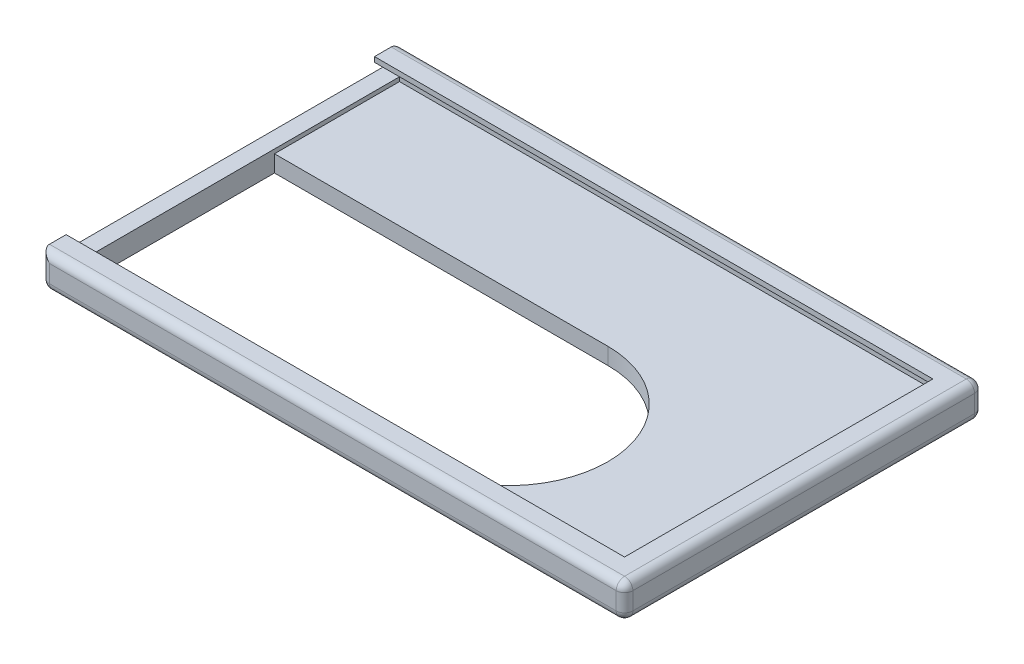
ISO-10303-21;
HEADER;
FILE_DESCRIPTION(('STEP AP214'),'2;1');
FILE_NAME('part.step','',(''),(''),'','','');
FILE_SCHEMA(('AUTOMOTIVE_DESIGN { 1 0 10303 214 1 1 1 1 }'));
ENDSEC;
DATA;
#1=APPLICATION_CONTEXT('core data for automotive mechanical design processes');
#2=APPLICATION_PROTOCOL_DEFINITION('international standard','automotive_design',2000,#1);
#3=PRODUCT_CONTEXT('',#1,'mechanical');
#4=PRODUCT('Part','Part','',(#3));
#5=PRODUCT_RELATED_PRODUCT_CATEGORY('part','',(#4));
#6=PRODUCT_DEFINITION_FORMATION('','',#4);
#7=PRODUCT_DEFINITION_CONTEXT('part definition',#1,'design');
#8=PRODUCT_DEFINITION('design','',#6,#7);
#9=PRODUCT_DEFINITION_SHAPE('','',#8);
#10=(LENGTH_UNIT() NAMED_UNIT(*) SI_UNIT(.MILLI.,.METRE.));
#11=(NAMED_UNIT(*) PLANE_ANGLE_UNIT() SI_UNIT($,.RADIAN.));
#12=(NAMED_UNIT(*) SI_UNIT($,.STERADIAN.) SOLID_ANGLE_UNIT());
#13=UNCERTAINTY_MEASURE_WITH_UNIT(LENGTH_MEASURE(1.E-05),#10,'distance_accuracy_value','');
#14=(GEOMETRIC_REPRESENTATION_CONTEXT(3) GLOBAL_UNCERTAINTY_ASSIGNED_CONTEXT((#13)) GLOBAL_UNIT_ASSIGNED_CONTEXT((#10,
#11,#12)) REPRESENTATION_CONTEXT('',''));
#15=CARTESIAN_POINT('',(0.,0.,0.));
#16=DIRECTION('',(0.,0.,1.));
#17=DIRECTION('',(1.,0.,0.));
#18=AXIS2_PLACEMENT_3D('',#15,#16,#17);
#19=CARTESIAN_POINT('',(0.,2.,0.));
#20=DIRECTION('',(0.,-1.,0.));
#21=DIRECTION('',(0.,0.,-1.));
#22=AXIS2_PLACEMENT_3D('',#19,#20,#21);
#23=PLANE('',#22);
#24=CARTESIAN_POINT('',(40.,2.,27.));
#25=DIRECTION('',(0.,-1.,0.));
#26=DIRECTION('',(0.,0.,-1.));
#27=AXIS2_PLACEMENT_3D('',#24,#25,#26);
#28=CIRCLE('',#27,12.);
#29=CARTESIAN_POINT('',(40.,2.,39.));
#30=VERTEX_POINT('',#29);
#31=CARTESIAN_POINT('',(40.,2.,15.));
#32=VERTEX_POINT('',#31);
#33=EDGE_CURVE('E273',#30,#32,#28,.F.);
#34=ORIENTED_EDGE('',*,*,#33,.F.);
#35=DIRECTION('',(-1.,0.,0.));
#36=VECTOR('',#35,1.);
#37=CARTESIAN_POINT('',(66.,2.,39.));
#38=LINE('',#37,#36);
#39=CARTESIAN_POINT('',(66.,2.,39.));
#40=VERTEX_POINT('',#39);
#41=EDGE_CURVE('E307',#40,#30,#38,.T.);
#42=ORIENTED_EDGE('',*,*,#41,.F.);
#43=DIRECTION('',(0.,0.,1.));
#44=VECTOR('',#43,1.);
#45=CARTESIAN_POINT('',(66.,2.,0.));
#46=LINE('',#45,#44);
#47=CARTESIAN_POINT('',(66.,2.,0.));
#48=VERTEX_POINT('',#47);
#49=EDGE_CURVE('E304',#48,#40,#46,.T.);
#50=ORIENTED_EDGE('',*,*,#49,.F.);
#51=DIRECTION('',(1.,0.,0.));
#52=VECTOR('',#51,1.);
#53=CARTESIAN_POINT('',(0.,2.,0.));
#54=LINE('',#53,#52);
#55=CARTESIAN_POINT('',(0.,2.,0.));
#56=VERTEX_POINT('',#55);
#57=EDGE_CURVE('E301',#56,#48,#54,.T.);
#58=ORIENTED_EDGE('',*,*,#57,.F.);
#59=DIRECTION('',(0.,0.,1.));
#60=VECTOR('',#59,1.);
#61=CARTESIAN_POINT('',(0.,2.,0.));
#62=LINE('',#61,#60);
#63=CARTESIAN_POINT('',(0.,2.,15.));
#64=VERTEX_POINT('',#63);
#65=EDGE_CURVE('E310',#56,#64,#62,.T.);
#66=ORIENTED_EDGE('',*,*,#65,.T.);
#67=DIRECTION('',(-1.,0.,0.));
#68=VECTOR('',#67,1.);
#69=CARTESIAN_POINT('',(0.,2.,15.));
#70=LINE('',#69,#68);
#71=EDGE_CURVE('E271',#32,#64,#70,.T.);
#72=ORIENTED_EDGE('',*,*,#71,.F.);
#73=EDGE_LOOP('',(#34,#42,#50,#58,#66,#72));
#74=FACE_BOUND('',#73,.T.);
#75=ADVANCED_FACE('F39',(#74),#23,.F.);
#76=CARTESIAN_POINT('',(0.,0.,0.));
#77=DIRECTION('',(0.,-1.,0.));
#78=DIRECTION('',(0.,0.,-1.));
#79=AXIS2_PLACEMENT_3D('',#76,#77,#78);
#80=PLANE('',#79);
#81=DIRECTION('',(0.,0.,1.));
#82=VECTOR('',#81,1.);
#83=CARTESIAN_POINT('',(67.,0.,0.));
#84=LINE('',#83,#82);
#85=CARTESIAN_POINT('',(67.,0.,-1.));
#86=VERTEX_POINT('',#85);
#87=CARTESIAN_POINT('',(67.,0.,40.));
#88=VERTEX_POINT('',#87);
#89=EDGE_CURVE('E338',#86,#88,#84,.T.);
#90=ORIENTED_EDGE('',*,*,#89,.T.);
#91=DIRECTION('',(1.,0.,0.));
#92=VECTOR('',#91,1.);
#93=CARTESIAN_POINT('',(-2.,0.,40.));
#94=LINE('',#93,#92);
#95=CARTESIAN_POINT('',(-0.999999999999995,0.,40.));
#96=VERTEX_POINT('',#95);
#97=EDGE_CURVE('E340',#88,#96,#94,.F.);
#98=ORIENTED_EDGE('',*,*,#97,.T.);
#99=DIRECTION('',(0.,0.,1.));
#100=VECTOR('',#99,1.);
#101=CARTESIAN_POINT('',(-1.,0.,-2.));
#102=LINE('',#101,#100);
#103=CARTESIAN_POINT('',(-1.,0.,-1.));
#104=VERTEX_POINT('',#103);
#105=EDGE_CURVE('E334',#96,#104,#102,.F.);
#106=ORIENTED_EDGE('',*,*,#105,.T.);
#107=DIRECTION('',(1.,0.,0.));
#108=VECTOR('',#107,1.);
#109=CARTESIAN_POINT('',(0.,0.,-1.));
#110=LINE('',#109,#108);
#111=EDGE_CURVE('E336',#104,#86,#110,.T.);
#112=ORIENTED_EDGE('',*,*,#111,.T.);
#113=EDGE_LOOP('',(#90,#98,#106,#112));
#114=FACE_BOUND('',#113,.T.);
#115=DIRECTION('',(0.,0.,1.));
#116=VECTOR('',#115,1.);
#117=CARTESIAN_POINT('',(0.,0.,0.));
#118=LINE('',#117,#116);
#119=CARTESIAN_POINT('',(0.,0.,15.));
#120=VERTEX_POINT('',#119);
#121=CARTESIAN_POINT('',(0.,0.,39.));
#122=VERTEX_POINT('',#121);
#123=EDGE_CURVE('E282',#120,#122,#118,.T.);
#124=ORIENTED_EDGE('',*,*,#123,.T.);
#125=DIRECTION('',(1.,0.,0.));
#126=VECTOR('',#125,1.);
#127=CARTESIAN_POINT('',(0.,0.,39.));
#128=LINE('',#127,#126);
#129=CARTESIAN_POINT('',(40.,0.,39.));
#130=VERTEX_POINT('',#129);
#131=EDGE_CURVE('E285',#122,#130,#128,.T.);
#132=ORIENTED_EDGE('',*,*,#131,.T.);
#133=CARTESIAN_POINT('',(40.,0.,27.));
#134=DIRECTION('',(0.,1.,0.));
#135=DIRECTION('',(0.,0.,1.));
#136=AXIS2_PLACEMENT_3D('',#133,#134,#135);
#137=CIRCLE('',#136,12.);
#138=CARTESIAN_POINT('',(40.,0.,15.));
#139=VERTEX_POINT('',#138);
#140=EDGE_CURVE('E269',#139,#130,#137,.F.);
#141=ORIENTED_EDGE('',*,*,#140,.F.);
#142=DIRECTION('',(1.,0.,0.));
#143=VECTOR('',#142,1.);
#144=CARTESIAN_POINT('',(0.,0.,15.));
#145=LINE('',#144,#143);
#146=EDGE_CURVE('E280',#120,#139,#145,.T.);
#147=ORIENTED_EDGE('',*,*,#146,.F.);
#148=EDGE_LOOP('',(#124,#132,#141,#147));
#149=FACE_BOUND('',#148,.T.);
#150=ADVANCED_FACE('F465',(#114,#149),#80,.T.);
#151=CARTESIAN_POINT('',(66.,4.,0.));
#152=DIRECTION('',(1.,0.,0.));
#153=DIRECTION('',(0.,0.,-1.));
#154=AXIS2_PLACEMENT_3D('',#151,#152,#153);
#155=PLANE('',#154);
#156=DIRECTION('',(0.,-1.,0.));
#157=VECTOR('',#156,1.);
#158=CARTESIAN_POINT('',(66.,4.,39.));
#159=LINE('',#158,#157);
#160=CARTESIAN_POINT('',(66.,3.5,39.));
#161=VERTEX_POINT('',#160);
#162=EDGE_CURVE('E299',#161,#40,#159,.T.);
#163=ORIENTED_EDGE('',*,*,#162,.F.);
#164=DIRECTION('',(0.,0.,-1.));
#165=VECTOR('',#164,1.);
#166=CARTESIAN_POINT('',(66.,3.5,0.));
#167=LINE('',#166,#165);
#168=CARTESIAN_POINT('',(66.,3.5,0.));
#169=VERTEX_POINT('',#168);
#170=EDGE_CURVE('E252',#161,#169,#167,.T.);
#171=ORIENTED_EDGE('',*,*,#170,.T.);
#172=DIRECTION('',(0.,-1.,0.));
#173=VECTOR('',#172,1.);
#174=CARTESIAN_POINT('',(66.,4.,0.));
#175=LINE('',#174,#173);
#176=EDGE_CURVE('E277',#169,#48,#175,.T.);
#177=ORIENTED_EDGE('',*,*,#176,.T.);
#178=ORIENTED_EDGE('',*,*,#49,.T.);
#179=EDGE_LOOP('',(#163,#171,#177,#178));
#180=FACE_BOUND('',#179,.T.);
#181=ADVANCED_FACE('F500',(#180),#155,.F.);
#182=CARTESIAN_POINT('',(0.,4.,39.));
#183=DIRECTION('',(0.,0.,1.));
#184=DIRECTION('',(1.,0.,0.));
#185=AXIS2_PLACEMENT_3D('',#182,#183,#184);
#186=PLANE('',#185);
#187=DIRECTION('',(0.,1.,0.));
#188=VECTOR('',#187,1.);
#189=CARTESIAN_POINT('',(-2.,3.99999999999999,39.));
#190=LINE('',#189,#188);
#191=CARTESIAN_POINT('',(-2.,2.5,39.));
#192=VERTEX_POINT('',#191);
#193=CARTESIAN_POINT('',(-2.,3.5,39.));
#194=VERTEX_POINT('',#193);
#195=EDGE_CURVE('E256',#192,#194,#190,.T.);
#196=ORIENTED_EDGE('',*,*,#195,.T.);
#197=DIRECTION('',(1.,0.,0.));
#198=VECTOR('',#197,1.);
#199=CARTESIAN_POINT('',(0.,3.5,39.));
#200=LINE('',#199,#198);
#201=EDGE_CURVE('E254',#194,#161,#200,.T.);
#202=ORIENTED_EDGE('',*,*,#201,.T.);
#203=ORIENTED_EDGE('',*,*,#162,.T.);
#204=ORIENTED_EDGE('',*,*,#41,.T.);
#205=DIRECTION('',(0.,-1.,0.));
#206=VECTOR('',#205,1.);
#207=CARTESIAN_POINT('',(40.,59.2712842531054,39.));
#208=LINE('',#207,#206);
#209=EDGE_CURVE('E288',#30,#130,#208,.T.);
#210=ORIENTED_EDGE('',*,*,#209,.T.);
#211=ORIENTED_EDGE('',*,*,#131,.F.);
#212=DIRECTION('',(0.,-1.,0.));
#213=VECTOR('',#212,1.);
#214=CARTESIAN_POINT('',(0.,4.,39.));
#215=LINE('',#214,#213);
#216=CARTESIAN_POINT('',(0.,2.5,39.));
#217=VERTEX_POINT('',#216);
#218=EDGE_CURVE('E297',#217,#122,#215,.T.);
#219=ORIENTED_EDGE('',*,*,#218,.F.);
#220=DIRECTION('',(1.,0.,0.));
#221=VECTOR('',#220,1.);
#222=CARTESIAN_POINT('',(-2.001,2.5,39.));
#223=LINE('',#222,#221);
#224=EDGE_CURVE('E266',#192,#217,#223,.T.);
#225=ORIENTED_EDGE('',*,*,#224,.F.);
#226=EDGE_LOOP('',(#196,#202,#203,#204,#210,#211,#219,#225));
#227=FACE_BOUND('',#226,.T.);
#228=ADVANCED_FACE('F577',(#227),#186,.F.);
#229=CARTESIAN_POINT('',(0.,4.,0.));
#230=DIRECTION('',(1.,0.,0.));
#231=DIRECTION('',(0.,0.,-1.));
#232=AXIS2_PLACEMENT_3D('',#229,#230,#231);
#233=PLANE('',#232);
#234=DIRECTION('',(0.,0.,-1.));
#235=VECTOR('',#234,1.);
#236=CARTESIAN_POINT('',(0.,2.5,0.));
#237=LINE('',#236,#235);
#238=CARTESIAN_POINT('',(0.,2.5,0.));
#239=VERTEX_POINT('',#238);
#240=EDGE_CURVE('E263',#217,#239,#237,.T.);
#241=ORIENTED_EDGE('',*,*,#240,.F.);
#242=ORIENTED_EDGE('',*,*,#218,.T.);
#243=ORIENTED_EDGE('',*,*,#123,.F.);
#244=DIRECTION('',(0.,-1.,0.));
#245=VECTOR('',#244,1.);
#246=CARTESIAN_POINT('',(0.,59.2712842531054,15.));
#247=LINE('',#246,#245);
#248=EDGE_CURVE('E290',#64,#120,#247,.T.);
#249=ORIENTED_EDGE('',*,*,#248,.F.);
#250=ORIENTED_EDGE('',*,*,#65,.F.);
#251=DIRECTION('',(0.,-1.,0.));
#252=VECTOR('',#251,1.);
#253=CARTESIAN_POINT('',(0.,4.,0.));
#254=LINE('',#253,#252);
#255=EDGE_CURVE('E295',#239,#56,#254,.T.);
#256=ORIENTED_EDGE('',*,*,#255,.F.);
#257=EDGE_LOOP('',(#241,#242,#243,#249,#250,#256));
#258=FACE_BOUND('',#257,.T.);
#259=ADVANCED_FACE('F573',(#258),#233,.T.);
#260=CARTESIAN_POINT('',(0.,4.,0.));
#261=DIRECTION('',(0.,0.,-1.));
#262=DIRECTION('',(-1.,0.,0.));
#263=AXIS2_PLACEMENT_3D('',#260,#261,#262);
#264=PLANE('',#263);
#265=ORIENTED_EDGE('',*,*,#176,.F.);
#266=DIRECTION('',(-1.,0.,0.));
#267=VECTOR('',#266,1.);
#268=CARTESIAN_POINT('',(0.,3.5,0.));
#269=LINE('',#268,#267);
#270=CARTESIAN_POINT('',(-2.,3.5,0.));
#271=VERTEX_POINT('',#270);
#272=EDGE_CURVE('E247',#169,#271,#269,.T.);
#273=ORIENTED_EDGE('',*,*,#272,.T.);
#274=DIRECTION('',(0.,-1.,0.));
#275=VECTOR('',#274,1.);
#276=CARTESIAN_POINT('',(-2.,4.,0.));
#277=LINE('',#276,#275);
#278=CARTESIAN_POINT('',(-2.,2.5,0.));
#279=VERTEX_POINT('',#278);
#280=EDGE_CURVE('E261',#271,#279,#277,.T.);
#281=ORIENTED_EDGE('',*,*,#280,.T.);
#282=DIRECTION('',(1.,0.,0.));
#283=VECTOR('',#282,1.);
#284=CARTESIAN_POINT('',(-2.00100000000001,2.5,0.));
#285=LINE('',#284,#283);
#286=EDGE_CURVE('E267',#279,#239,#285,.T.);
#287=ORIENTED_EDGE('',*,*,#286,.T.);
#288=ORIENTED_EDGE('',*,*,#255,.T.);
#289=ORIENTED_EDGE('',*,*,#57,.T.);
#290=EDGE_LOOP('',(#265,#273,#281,#287,#288,#289));
#291=FACE_BOUND('',#290,.T.);
#292=ADVANCED_FACE('F570',(#291),#264,.F.);
#293=CARTESIAN_POINT('',(0.,4.,-2.));
#294=DIRECTION('',(0.,0.,-1.));
#295=DIRECTION('',(-1.,0.,0.));
#296=AXIS2_PLACEMENT_3D('',#293,#294,#295);
#297=PLANE('',#296);
#298=DIRECTION('',(-1.,0.,0.));
#299=VECTOR('',#298,1.);
#300=CARTESIAN_POINT('',(68.,3.1,-2.));
#301=LINE('',#300,#299);
#302=CARTESIAN_POINT('',(-1.,3.1,-2.));
#303=VERTEX_POINT('',#302);
#304=CARTESIAN_POINT('',(67.,3.1,-2.));
#305=VERTEX_POINT('',#304);
#306=EDGE_CURVE('E48',#303,#305,#301,.F.);
#307=ORIENTED_EDGE('',*,*,#306,.T.);
#308=DIRECTION('',(0.,-1.,0.));
#309=VECTOR('',#308,1.);
#310=CARTESIAN_POINT('',(67.,4.,-2.));
#311=LINE('',#310,#309);
#312=CARTESIAN_POINT('',(67.,1.,-2.));
#313=VERTEX_POINT('',#312);
#314=EDGE_CURVE('E11',#305,#313,#311,.T.);
#315=ORIENTED_EDGE('',*,*,#314,.T.);
#316=DIRECTION('',(1.,0.,0.));
#317=VECTOR('',#316,1.);
#318=CARTESIAN_POINT('',(0.,1.,-2.));
#319=LINE('',#318,#317);
#320=CARTESIAN_POINT('',(-1.,1.,-2.));
#321=VERTEX_POINT('',#320);
#322=EDGE_CURVE('E352',#313,#321,#319,.F.);
#323=ORIENTED_EDGE('',*,*,#322,.T.);
#324=DIRECTION('',(0.,-1.,0.));
#325=VECTOR('',#324,1.);
#326=CARTESIAN_POINT('',(-1.,4.1,-2.));
#327=LINE('',#326,#325);
#328=EDGE_CURVE('E59',#321,#303,#327,.F.);
#329=ORIENTED_EDGE('',*,*,#328,.T.);
#330=EDGE_LOOP('',(#307,#315,#323,#329));
#331=FACE_BOUND('',#330,.T.);
#332=ADVANCED_FACE('F504',(#331),#297,.T.);
#333=CARTESIAN_POINT('',(-2.,4.,0.));
#334=DIRECTION('',(1.,0.,0.));
#335=DIRECTION('',(0.,0.,-1.));
#336=AXIS2_PLACEMENT_3D('',#333,#334,#335);
#337=PLANE('',#336);
#338=DIRECTION('',(0.,0.,1.));
#339=VECTOR('',#338,1.);
#340=CARTESIAN_POINT('',(-2.,1.,41.));
#341=LINE('',#340,#339);
#342=CARTESIAN_POINT('',(-2.,1.,-1.));
#343=VERTEX_POINT('',#342);
#344=CARTESIAN_POINT('',(-2.,1.,40.));
#345=VERTEX_POINT('',#344);
#346=EDGE_CURVE('E322',#343,#345,#341,.T.);
#347=ORIENTED_EDGE('',*,*,#346,.T.);
#348=DIRECTION('',(0.,-1.,0.));
#349=VECTOR('',#348,1.);
#350=CARTESIAN_POINT('',(-2.,4.,40.));
#351=LINE('',#350,#349);
#352=CARTESIAN_POINT('',(-2.,4.1,40.));
#353=VERTEX_POINT('',#352);
#354=EDGE_CURVE('E326',#345,#353,#351,.F.);
#355=ORIENTED_EDGE('',*,*,#354,.T.);
#356=DIRECTION('',(0.,0.,1.));
#357=VECTOR('',#356,1.);
#358=CARTESIAN_POINT('',(-2.,4.1,41.));
#359=LINE('',#358,#357);
#360=CARTESIAN_POINT('',(-2.,4.1,38.));
#361=VERTEX_POINT('',#360);
#362=EDGE_CURVE('E211',#361,#353,#359,.T.);
#363=ORIENTED_EDGE('',*,*,#362,.F.);
#364=DIRECTION('',(0.,1.,0.));
#365=VECTOR('',#364,1.);
#366=CARTESIAN_POINT('',(-2.,3.5,38.));
#367=LINE('',#366,#365);
#368=CARTESIAN_POINT('',(-2.,3.5,38.));
#369=VERTEX_POINT('',#368);
#370=EDGE_CURVE('E245',#369,#361,#367,.T.);
#371=ORIENTED_EDGE('',*,*,#370,.F.);
#372=DIRECTION('',(0.,0.,1.));
#373=VECTOR('',#372,1.);
#374=CARTESIAN_POINT('',(-2.,3.5,41.));
#375=LINE('',#374,#373);
#376=EDGE_CURVE('E234',#369,#194,#375,.T.);
#377=ORIENTED_EDGE('',*,*,#376,.T.);
#378=ORIENTED_EDGE('',*,*,#195,.F.);
#379=DIRECTION('',(0.,0.,1.));
#380=VECTOR('',#379,1.);
#381=CARTESIAN_POINT('',(-2.,2.5,0.));
#382=LINE('',#381,#380);
#383=EDGE_CURVE('E258',#279,#192,#382,.T.);
#384=ORIENTED_EDGE('',*,*,#383,.F.);
#385=ORIENTED_EDGE('',*,*,#280,.F.);
#386=DIRECTION('',(0.,0.,1.));
#387=VECTOR('',#386,1.);
#388=CARTESIAN_POINT('',(-2.,3.5,1.));
#389=LINE('',#388,#387);
#390=CARTESIAN_POINT('',(-2.,3.5,1.));
#391=VERTEX_POINT('',#390);
#392=EDGE_CURVE('E218',#271,#391,#389,.T.);
#393=ORIENTED_EDGE('',*,*,#392,.T.);
#394=DIRECTION('',(0.,1.,0.));
#395=VECTOR('',#394,1.);
#396=CARTESIAN_POINT('',(-2.,3.5,1.));
#397=LINE('',#396,#395);
#398=CARTESIAN_POINT('',(-2.,4.1,1.));
#399=VERTEX_POINT('',#398);
#400=EDGE_CURVE('E214',#391,#399,#397,.T.);
#401=ORIENTED_EDGE('',*,*,#400,.T.);
#402=DIRECTION('',(0.,0.,1.));
#403=VECTOR('',#402,1.);
#404=CARTESIAN_POINT('',(-2.,4.1,1.));
#405=LINE('',#404,#403);
#406=CARTESIAN_POINT('',(-2.,4.1,-1.));
#407=VERTEX_POINT('',#406);
#408=EDGE_CURVE('E199',#407,#399,#405,.T.);
#409=ORIENTED_EDGE('',*,*,#408,.F.);
#410=DIRECTION('',(0.,-1.,0.));
#411=VECTOR('',#410,1.);
#412=CARTESIAN_POINT('',(-2.,0.,-1.));
#413=LINE('',#412,#411);
#414=EDGE_CURVE('E324',#407,#343,#413,.T.);
#415=ORIENTED_EDGE('',*,*,#414,.T.);
#416=EDGE_LOOP('',(#347,#355,#363,#371,#377,#378,#384,#385,#393,#401,#409,#415));
#417=FACE_BOUND('',#416,.T.);
#418=ADVANCED_FACE('F215',(#417),#337,.F.);
#419=CARTESIAN_POINT('',(0.,4.,41.));
#420=DIRECTION('',(0.,0.,-1.));
#421=DIRECTION('',(-1.,0.,0.));
#422=AXIS2_PLACEMENT_3D('',#419,#420,#421);
#423=PLANE('',#422);
#424=DIRECTION('',(1.,0.,0.));
#425=VECTOR('',#424,1.);
#426=CARTESIAN_POINT('',(0.,3.1,41.));
#427=LINE('',#426,#425);
#428=CARTESIAN_POINT('',(67.,3.1,41.));
#429=VERTEX_POINT('',#428);
#430=CARTESIAN_POINT('',(-0.999999999999995,3.1,41.));
#431=VERTEX_POINT('',#430);
#432=EDGE_CURVE('E317',#429,#431,#427,.F.);
#433=ORIENTED_EDGE('',*,*,#432,.T.);
#434=DIRECTION('',(0.,-1.,0.));
#435=VECTOR('',#434,1.);
#436=CARTESIAN_POINT('',(-0.999999999999995,4.,41.));
#437=LINE('',#436,#435);
#438=CARTESIAN_POINT('',(-0.999999999999995,1.,41.));
#439=VERTEX_POINT('',#438);
#440=EDGE_CURVE('E319',#431,#439,#437,.T.);
#441=ORIENTED_EDGE('',*,*,#440,.T.);
#442=DIRECTION('',(1.,0.,0.));
#443=VECTOR('',#442,1.);
#444=CARTESIAN_POINT('',(68.,1.,41.));
#445=LINE('',#444,#443);
#446=CARTESIAN_POINT('',(67.,1.,41.));
#447=VERTEX_POINT('',#446);
#448=EDGE_CURVE('E315',#439,#447,#445,.T.);
#449=ORIENTED_EDGE('',*,*,#448,.T.);
#450=DIRECTION('',(0.,-1.,0.));
#451=VECTOR('',#450,1.);
#452=CARTESIAN_POINT('',(67.,4.1,41.));
#453=LINE('',#452,#451);
#454=EDGE_CURVE('E313',#447,#429,#453,.F.);
#455=ORIENTED_EDGE('',*,*,#454,.T.);
#456=EDGE_LOOP('',(#433,#441,#449,#455));
#457=FACE_BOUND('',#456,.T.);
#458=ADVANCED_FACE('F439',(#457),#423,.F.);
#459=CARTESIAN_POINT('',(68.,4.,0.));
#460=DIRECTION('',(1.,0.,0.));
#461=DIRECTION('',(0.,0.,-1.));
#462=AXIS2_PLACEMENT_3D('',#459,#460,#461);
#463=PLANE('',#462);
#464=DIRECTION('',(0.,0.,-1.));
#465=VECTOR('',#464,1.);
#466=CARTESIAN_POINT('',(68.,3.1,41.));
#467=LINE('',#466,#465);
#468=CARTESIAN_POINT('',(68.,3.1,-1.));
#469=VERTEX_POINT('',#468);
#470=CARTESIAN_POINT('',(68.,3.1,40.));
#471=VERTEX_POINT('',#470);
#472=EDGE_CURVE('E347',#469,#471,#467,.F.);
#473=ORIENTED_EDGE('',*,*,#472,.T.);
#474=DIRECTION('',(0.,-1.,0.));
#475=VECTOR('',#474,1.);
#476=CARTESIAN_POINT('',(68.,0.,40.));
#477=LINE('',#476,#475);
#478=CARTESIAN_POINT('',(68.,1.,40.));
#479=VERTEX_POINT('',#478);
#480=EDGE_CURVE('E349',#471,#479,#477,.T.);
#481=ORIENTED_EDGE('',*,*,#480,.T.);
#482=DIRECTION('',(0.,0.,1.));
#483=VECTOR('',#482,1.);
#484=CARTESIAN_POINT('',(68.,1.,0.));
#485=LINE('',#484,#483);
#486=CARTESIAN_POINT('',(68.,1.,-1.));
#487=VERTEX_POINT('',#486);
#488=EDGE_CURVE('E345',#479,#487,#485,.F.);
#489=ORIENTED_EDGE('',*,*,#488,.T.);
#490=DIRECTION('',(0.,-1.,0.));
#491=VECTOR('',#490,1.);
#492=CARTESIAN_POINT('',(68.,4.,-1.));
#493=LINE('',#492,#491);
#494=EDGE_CURVE('E343',#487,#469,#493,.F.);
#495=ORIENTED_EDGE('',*,*,#494,.T.);
#496=EDGE_LOOP('',(#473,#481,#489,#495));
#497=FACE_BOUND('',#496,.T.);
#498=ADVANCED_FACE('F479',(#497),#463,.T.);
#499=CARTESIAN_POINT('',(0.,59.2712842531054,15.));
#500=DIRECTION('',(0.,0.,-1.));
#501=DIRECTION('',(-1.,0.,0.));
#502=AXIS2_PLACEMENT_3D('',#499,#500,#501);
#503=PLANE('',#502);
#504=ORIENTED_EDGE('',*,*,#71,.T.);
#505=ORIENTED_EDGE('',*,*,#248,.T.);
#506=ORIENTED_EDGE('',*,*,#146,.T.);
#507=DIRECTION('',(0.,-1.,0.));
#508=VECTOR('',#507,1.);
#509=CARTESIAN_POINT('',(40.,59.2712842531054,15.));
#510=LINE('',#509,#508);
#511=EDGE_CURVE('E274',#32,#139,#510,.T.);
#512=ORIENTED_EDGE('',*,*,#511,.F.);
#513=EDGE_LOOP('',(#504,#505,#506,#512));
#514=FACE_BOUND('',#513,.T.);
#515=ADVANCED_FACE('F563',(#514),#503,.F.);
#516=CARTESIAN_POINT('',(40.,59.2712842531054,27.));
#517=DIRECTION('',(0.,-1.,0.));
#518=DIRECTION('',(0.,0.,-1.));
#519=AXIS2_PLACEMENT_3D('',#516,#517,#518);
#520=CYLINDRICAL_SURFACE('',#519,12.);
#521=ORIENTED_EDGE('',*,*,#33,.T.);
#522=ORIENTED_EDGE('',*,*,#511,.T.);
#523=ORIENTED_EDGE('',*,*,#140,.T.);
#524=ORIENTED_EDGE('',*,*,#209,.F.);
#525=EDGE_LOOP('',(#521,#522,#523,#524));
#526=FACE_BOUND('',#525,.T.);
#527=ADVANCED_FACE('F561',(#526),#520,.F.);
#528=CARTESIAN_POINT('',(-2.00100000000001,2.5,0.));
#529=DIRECTION('',(0.,-1.,0.));
#530=DIRECTION('',(0.,0.,-1.));
#531=AXIS2_PLACEMENT_3D('',#528,#529,#530);
#532=PLANE('',#531);
#533=ORIENTED_EDGE('',*,*,#383,.T.);
#534=ORIENTED_EDGE('',*,*,#224,.T.);
#535=ORIENTED_EDGE('',*,*,#240,.T.);
#536=ORIENTED_EDGE('',*,*,#286,.F.);
#537=EDGE_LOOP('',(#533,#534,#535,#536));
#538=FACE_BOUND('',#537,.T.);
#539=ADVANCED_FACE('F551',(#538),#532,.F.);
#540=CARTESIAN_POINT('',(0.,3.5,0.));
#541=DIRECTION('',(0.,-1.,0.));
#542=DIRECTION('',(0.,0.,-1.));
#543=AXIS2_PLACEMENT_3D('',#540,#541,#542);
#544=PLANE('',#543);
#545=ORIENTED_EDGE('',*,*,#201,.F.);
#546=ORIENTED_EDGE('',*,*,#376,.F.);
#547=DIRECTION('',(-1.,0.,0.));
#548=VECTOR('',#547,1.);
#549=CARTESIAN_POINT('',(-2.,3.5,38.));
#550=LINE('',#549,#548);
#551=CARTESIAN_POINT('',(65.,3.5,38.));
#552=VERTEX_POINT('',#551);
#553=EDGE_CURVE('E223',#552,#369,#550,.T.);
#554=ORIENTED_EDGE('',*,*,#553,.F.);
#555=DIRECTION('',(0.,0.,1.));
#556=VECTOR('',#555,1.);
#557=CARTESIAN_POINT('',(65.,3.5,1.));
#558=LINE('',#557,#556);
#559=CARTESIAN_POINT('',(65.,3.5,1.));
#560=VERTEX_POINT('',#559);
#561=EDGE_CURVE('E240',#560,#552,#558,.T.);
#562=ORIENTED_EDGE('',*,*,#561,.F.);
#563=DIRECTION('',(1.,0.,0.));
#564=VECTOR('',#563,1.);
#565=CARTESIAN_POINT('',(-2.,3.5,1.));
#566=LINE('',#565,#564);
#567=EDGE_CURVE('E238',#391,#560,#566,.T.);
#568=ORIENTED_EDGE('',*,*,#567,.F.);
#569=ORIENTED_EDGE('',*,*,#392,.F.);
#570=ORIENTED_EDGE('',*,*,#272,.F.);
#571=ORIENTED_EDGE('',*,*,#170,.F.);
#572=EDGE_LOOP('',(#545,#546,#554,#562,#568,#569,#570,#571));
#573=FACE_BOUND('',#572,.T.);
#574=ADVANCED_FACE('F547',(#573),#544,.T.);
#575=CARTESIAN_POINT('',(-2.,3.5,38.));
#576=DIRECTION('',(0.,0.,-1.));
#577=DIRECTION('',(-1.,0.,0.));
#578=AXIS2_PLACEMENT_3D('',#575,#576,#577);
#579=PLANE('',#578);
#580=ORIENTED_EDGE('',*,*,#370,.T.);
#581=DIRECTION('',(-1.,0.,0.));
#582=VECTOR('',#581,1.);
#583=CARTESIAN_POINT('',(-2.,4.1,38.));
#584=LINE('',#583,#582);
#585=CARTESIAN_POINT('',(65.,4.1,38.));
#586=VERTEX_POINT('',#585);
#587=EDGE_CURVE('E228',#586,#361,#584,.T.);
#588=ORIENTED_EDGE('',*,*,#587,.F.);
#589=DIRECTION('',(0.,1.,0.));
#590=VECTOR('',#589,1.);
#591=CARTESIAN_POINT('',(65.,3.5,38.));
#592=LINE('',#591,#590);
#593=EDGE_CURVE('E248',#552,#586,#592,.T.);
#594=ORIENTED_EDGE('',*,*,#593,.F.);
#595=ORIENTED_EDGE('',*,*,#553,.T.);
#596=EDGE_LOOP('',(#580,#588,#594,#595));
#597=FACE_BOUND('',#596,.T.);
#598=ADVANCED_FACE('F550',(#597),#579,.T.);
#599=CARTESIAN_POINT('',(65.,3.5,1.));
#600=DIRECTION('',(-1.,0.,0.));
#601=DIRECTION('',(0.,0.,1.));
#602=AXIS2_PLACEMENT_3D('',#599,#600,#601);
#603=PLANE('',#602);
#604=ORIENTED_EDGE('',*,*,#593,.T.);
#605=DIRECTION('',(0.,0.,1.));
#606=VECTOR('',#605,1.);
#607=CARTESIAN_POINT('',(65.,4.1,1.));
#608=LINE('',#607,#606);
#609=CARTESIAN_POINT('',(65.,4.1,1.));
#610=VERTEX_POINT('',#609);
#611=EDGE_CURVE('E226',#610,#586,#608,.T.);
#612=ORIENTED_EDGE('',*,*,#611,.F.);
#613=DIRECTION('',(0.,1.,0.));
#614=VECTOR('',#613,1.);
#615=CARTESIAN_POINT('',(65.,3.5,1.));
#616=LINE('',#615,#614);
#617=EDGE_CURVE('E222',#560,#610,#616,.T.);
#618=ORIENTED_EDGE('',*,*,#617,.F.);
#619=ORIENTED_EDGE('',*,*,#561,.T.);
#620=EDGE_LOOP('',(#604,#612,#618,#619));
#621=FACE_BOUND('',#620,.T.);
#622=ADVANCED_FACE('F544',(#621),#603,.T.);
#623=CARTESIAN_POINT('',(-2.,3.5,1.));
#624=DIRECTION('',(0.,0.,1.));
#625=DIRECTION('',(1.,0.,0.));
#626=AXIS2_PLACEMENT_3D('',#623,#624,#625);
#627=PLANE('',#626);
#628=ORIENTED_EDGE('',*,*,#617,.T.);
#629=DIRECTION('',(1.,0.,0.));
#630=VECTOR('',#629,1.);
#631=CARTESIAN_POINT('',(-2.,4.1,1.));
#632=LINE('',#631,#630);
#633=EDGE_CURVE('E205',#399,#610,#632,.T.);
#634=ORIENTED_EDGE('',*,*,#633,.F.);
#635=ORIENTED_EDGE('',*,*,#400,.F.);
#636=ORIENTED_EDGE('',*,*,#567,.T.);
#637=EDGE_LOOP('',(#628,#634,#635,#636));
#638=FACE_BOUND('',#637,.T.);
#639=ADVANCED_FACE('F225',(#638),#627,.T.);
#640=CARTESIAN_POINT('',(0.,4.1,0.));
#641=DIRECTION('',(0.,-1.,0.));
#642=DIRECTION('',(0.,0.,-1.));
#643=AXIS2_PLACEMENT_3D('',#640,#641,#642);
#644=PLANE('',#643);
#645=ORIENTED_EDGE('',*,*,#362,.T.);
#646=DIRECTION('',(1.,0.,0.));
#647=VECTOR('',#646,1.);
#648=CARTESIAN_POINT('',(0.,4.1,40.));
#649=LINE('',#648,#647);
#650=CARTESIAN_POINT('',(67.,4.1,40.));
#651=VERTEX_POINT('',#650);
#652=EDGE_CURVE('E332',#353,#651,#649,.T.);
#653=ORIENTED_EDGE('',*,*,#652,.T.);
#654=DIRECTION('',(0.,0.,-1.));
#655=VECTOR('',#654,1.);
#656=CARTESIAN_POINT('',(67.,4.1,-2.));
#657=LINE('',#656,#655);
#658=CARTESIAN_POINT('',(67.,4.1,-1.));
#659=VERTEX_POINT('',#658);
#660=EDGE_CURVE('E330',#651,#659,#657,.T.);
#661=ORIENTED_EDGE('',*,*,#660,.T.);
#662=DIRECTION('',(-1.,0.,0.));
#663=VECTOR('',#662,1.);
#664=CARTESIAN_POINT('',(-2.,4.1,-1.));
#665=LINE('',#664,#663);
#666=EDGE_CURVE('E208',#659,#407,#665,.T.);
#667=ORIENTED_EDGE('',*,*,#666,.T.);
#668=ORIENTED_EDGE('',*,*,#408,.T.);
#669=ORIENTED_EDGE('',*,*,#633,.T.);
#670=ORIENTED_EDGE('',*,*,#611,.T.);
#671=ORIENTED_EDGE('',*,*,#587,.T.);
#672=EDGE_LOOP('',(#645,#653,#661,#667,#668,#669,#670,#671));
#673=FACE_BOUND('',#672,.T.);
#674=ADVANCED_FACE('F202',(#673),#644,.F.);
#675=CARTESIAN_POINT('',(67.,4.,-1.));
#676=DIRECTION('',(0.,-1.,0.));
#677=DIRECTION('',(0.,0.,-1.));
#678=AXIS2_PLACEMENT_3D('',#675,#676,#677);
#679=CYLINDRICAL_SURFACE('',#678,1.);
#680=CARTESIAN_POINT('',(67.,1.,-1.));
#681=DIRECTION('',(0.,-1.,0.));
#682=DIRECTION('',(0.,0.,-1.));
#683=AXIS2_PLACEMENT_3D('',#680,#681,#682);
#684=CIRCLE('',#683,1.);
#685=EDGE_CURVE('E43',#313,#487,#684,.T.);
#686=ORIENTED_EDGE('',*,*,#685,.F.);
#687=ORIENTED_EDGE('',*,*,#314,.F.);
#688=CARTESIAN_POINT('',(67.,3.1,-1.));
#689=DIRECTION('',(0.,1.,0.));
#690=DIRECTION('',(0.,0.,1.));
#691=AXIS2_PLACEMENT_3D('',#688,#689,#690);
#692=CIRCLE('',#691,1.);
#693=EDGE_CURVE('E403',#469,#305,#692,.T.);
#694=ORIENTED_EDGE('',*,*,#693,.F.);
#695=ORIENTED_EDGE('',*,*,#494,.F.);
#696=EDGE_LOOP('',(#686,#687,#694,#695));
#697=FACE_BOUND('',#696,.T.);
#698=ADVANCED_FACE('F41',(#697),#679,.T.);
#699=CARTESIAN_POINT('',(67.,1.,-1.));
#700=DIRECTION('',(1.,0.,0.));
#701=DIRECTION('',(0.,0.,-1.));
#702=AXIS2_PLACEMENT_3D('',#699,#700,#701);
#703=SPHERICAL_SURFACE('',#702,1.);
#704=CARTESIAN_POINT('',(67.,1.,-1.));
#705=DIRECTION('',(1.,0.,0.));
#706=DIRECTION('',(0.,0.,-1.));
#707=AXIS2_PLACEMENT_3D('',#704,#705,#706);
#708=CIRCLE('',#707,1.);
#709=EDGE_CURVE('E397',#313,#86,#708,.F.);
#710=ORIENTED_EDGE('',*,*,#709,.F.);
#711=ORIENTED_EDGE('',*,*,#685,.T.);
#712=CARTESIAN_POINT('',(67.,1.,-1.));
#713=DIRECTION('',(0.,0.,-1.));
#714=DIRECTION('',(-1.,0.,0.));
#715=AXIS2_PLACEMENT_3D('',#712,#713,#714);
#716=CIRCLE('',#715,1.);
#717=EDGE_CURVE('E400',#86,#487,#716,.F.);
#718=ORIENTED_EDGE('',*,*,#717,.F.);
#719=EDGE_LOOP('',(#710,#711,#718));
#720=FACE_BOUND('',#719,.T.);
#721=ADVANCED_FACE('F492',(#720),#703,.T.);
#722=CARTESIAN_POINT('',(0.,3.1,-1.));
#723=DIRECTION('',(1.,0.,0.));
#724=DIRECTION('',(0.,0.,-1.));
#725=AXIS2_PLACEMENT_3D('',#722,#723,#724);
#726=CYLINDRICAL_SURFACE('',#725,1.);
#727=CARTESIAN_POINT('',(67.,3.1,-1.));
#728=DIRECTION('',(1.,0.,0.));
#729=DIRECTION('',(0.,0.,-1.));
#730=AXIS2_PLACEMENT_3D('',#727,#728,#729);
#731=CIRCLE('',#730,1.);
#732=EDGE_CURVE('E405',#305,#659,#731,.T.);
#733=ORIENTED_EDGE('',*,*,#732,.F.);
#734=ORIENTED_EDGE('',*,*,#306,.F.);
#735=CARTESIAN_POINT('',(-1.,3.1,-1.));
#736=DIRECTION('',(0.707106781186547,0.707106781186547,0.));
#737=DIRECTION('',(-0.707106781186547,0.707106781186547,0.));
#738=AXIS2_PLACEMENT_3D('',#735,#736,#737);
#739=ELLIPSE('',#738,1.41421356237309,1.);
#740=EDGE_CURVE('E394',#407,#303,#739,.F.);
#741=ORIENTED_EDGE('',*,*,#740,.F.);
#742=ORIENTED_EDGE('',*,*,#666,.F.);
#743=EDGE_LOOP('',(#733,#734,#741,#742));
#744=FACE_BOUND('',#743,.T.);
#745=ADVANCED_FACE('F452',(#744),#726,.T.);
#746=CARTESIAN_POINT('',(67.,3.1,-1.));
#747=DIRECTION('',(0.,0.,-1.));
#748=DIRECTION('',(-1.,0.,0.));
#749=AXIS2_PLACEMENT_3D('',#746,#747,#748);
#750=SPHERICAL_SURFACE('',#749,1.);
#751=ORIENTED_EDGE('',*,*,#693,.T.);
#752=ORIENTED_EDGE('',*,*,#732,.T.);
#753=CARTESIAN_POINT('',(67.,3.1,-1.));
#754=DIRECTION('',(0.,0.,-1.));
#755=DIRECTION('',(-1.,0.,0.));
#756=AXIS2_PLACEMENT_3D('',#753,#754,#755);
#757=CIRCLE('',#756,1.);
#758=EDGE_CURVE('E391',#469,#659,#757,.F.);
#759=ORIENTED_EDGE('',*,*,#758,.F.);
#760=EDGE_LOOP('',(#751,#752,#759));
#761=FACE_BOUND('',#760,.T.);
#762=ADVANCED_FACE('F483',(#761),#750,.T.);
#763=CARTESIAN_POINT('',(67.,1.,0.));
#764=DIRECTION('',(0.,0.,1.));
#765=DIRECTION('',(1.,0.,0.));
#766=AXIS2_PLACEMENT_3D('',#763,#764,#765);
#767=CYLINDRICAL_SURFACE('',#766,1.);
#768=ORIENTED_EDGE('',*,*,#717,.T.);
#769=ORIENTED_EDGE('',*,*,#488,.F.);
#770=CARTESIAN_POINT('',(67.,1.,40.));
#771=DIRECTION('',(0.,0.,1.));
#772=DIRECTION('',(1.,0.,0.));
#773=AXIS2_PLACEMENT_3D('',#770,#771,#772);
#774=CIRCLE('',#773,1.);
#775=EDGE_CURVE('E386',#88,#479,#774,.T.);
#776=ORIENTED_EDGE('',*,*,#775,.F.);
#777=ORIENTED_EDGE('',*,*,#89,.F.);
#778=EDGE_LOOP('',(#768,#769,#776,#777));
#779=FACE_BOUND('',#778,.T.);
#780=ADVANCED_FACE('F471',(#779),#767,.T.);
#781=CARTESIAN_POINT('',(0.,1.,-1.));
#782=DIRECTION('',(1.,0.,0.));
#783=DIRECTION('',(0.,0.,-1.));
#784=AXIS2_PLACEMENT_3D('',#781,#782,#783);
#785=CYLINDRICAL_SURFACE('',#784,1.);
#786=ORIENTED_EDGE('',*,*,#709,.T.);
#787=ORIENTED_EDGE('',*,*,#111,.F.);
#788=CARTESIAN_POINT('',(-1.,1.,-1.));
#789=DIRECTION('',(-1.,0.,0.));
#790=DIRECTION('',(0.,-1.,0.));
#791=AXIS2_PLACEMENT_3D('',#788,#789,#790);
#792=CIRCLE('',#791,1.);
#793=EDGE_CURVE('E383',#321,#104,#792,.T.);
#794=ORIENTED_EDGE('',*,*,#793,.F.);
#795=ORIENTED_EDGE('',*,*,#322,.F.);
#796=EDGE_LOOP('',(#786,#787,#794,#795));
#797=FACE_BOUND('',#796,.T.);
#798=ADVANCED_FACE('F490',(#797),#785,.T.);
#799=CARTESIAN_POINT('',(-1.,4.,-1.));
#800=DIRECTION('',(0.,1.,0.));
#801=DIRECTION('',(0.,0.,1.));
#802=AXIS2_PLACEMENT_3D('',#799,#800,#801);
#803=CYLINDRICAL_SURFACE('',#802,1.);
#804=ORIENTED_EDGE('',*,*,#740,.T.);
#805=ORIENTED_EDGE('',*,*,#328,.F.);
#806=CARTESIAN_POINT('',(-1.,1.,-1.));
#807=DIRECTION('',(0.,-1.,0.));
#808=DIRECTION('',(0.,0.,-1.));
#809=AXIS2_PLACEMENT_3D('',#806,#807,#808);
#810=CIRCLE('',#809,1.);
#811=EDGE_CURVE('E380',#343,#321,#810,.T.);
#812=ORIENTED_EDGE('',*,*,#811,.F.);
#813=ORIENTED_EDGE('',*,*,#414,.F.);
#814=EDGE_LOOP('',(#804,#805,#812,#813));
#815=FACE_BOUND('',#814,.T.);
#816=ADVANCED_FACE('F456',(#815),#803,.T.);
#817=CARTESIAN_POINT('',(67.,3.1,0.));
#818=DIRECTION('',(0.,0.,1.));
#819=DIRECTION('',(1.,0.,0.));
#820=AXIS2_PLACEMENT_3D('',#817,#818,#819);
#821=CYLINDRICAL_SURFACE('',#820,1.);
#822=ORIENTED_EDGE('',*,*,#758,.T.);
#823=ORIENTED_EDGE('',*,*,#660,.F.);
#824=CARTESIAN_POINT('',(67.,3.1,40.));
#825=DIRECTION('',(0.,0.,1.));
#826=DIRECTION('',(1.,0.,0.));
#827=AXIS2_PLACEMENT_3D('',#824,#825,#826);
#828=CIRCLE('',#827,1.);
#829=EDGE_CURVE('E377',#471,#651,#828,.T.);
#830=ORIENTED_EDGE('',*,*,#829,.F.);
#831=ORIENTED_EDGE('',*,*,#472,.F.);
#832=EDGE_LOOP('',(#822,#823,#830,#831));
#833=FACE_BOUND('',#832,.T.);
#834=ADVANCED_FACE('F450',(#833),#821,.T.);
#835=CARTESIAN_POINT('',(67.,4.,40.));
#836=DIRECTION('',(0.,1.,0.));
#837=DIRECTION('',(0.,0.,1.));
#838=AXIS2_PLACEMENT_3D('',#835,#836,#837);
#839=CYLINDRICAL_SURFACE('',#838,1.);
#840=CARTESIAN_POINT('',(67.,1.,40.));
#841=DIRECTION('',(0.,-1.,0.));
#842=DIRECTION('',(0.,0.,-1.));
#843=AXIS2_PLACEMENT_3D('',#840,#841,#842);
#844=CIRCLE('',#843,1.);
#845=EDGE_CURVE('E388',#479,#447,#844,.T.);
#846=ORIENTED_EDGE('',*,*,#845,.F.);
#847=ORIENTED_EDGE('',*,*,#480,.F.);
#848=CARTESIAN_POINT('',(67.,3.1,40.));
#849=DIRECTION('',(0.,1.,0.));
#850=DIRECTION('',(0.,0.,1.));
#851=AXIS2_PLACEMENT_3D('',#848,#849,#850);
#852=CIRCLE('',#851,1.);
#853=EDGE_CURVE('E374',#429,#471,#852,.T.);
#854=ORIENTED_EDGE('',*,*,#853,.F.);
#855=ORIENTED_EDGE('',*,*,#454,.F.);
#856=EDGE_LOOP('',(#846,#847,#854,#855));
#857=FACE_BOUND('',#856,.T.);
#858=ADVANCED_FACE('F477',(#857),#839,.T.);
#859=CARTESIAN_POINT('',(67.,1.,40.));
#860=DIRECTION('',(1.,0.,0.));
#861=DIRECTION('',(0.,0.,-1.));
#862=AXIS2_PLACEMENT_3D('',#859,#860,#861);
#863=SPHERICAL_SURFACE('',#862,1.);
#864=ORIENTED_EDGE('',*,*,#775,.T.);
#865=ORIENTED_EDGE('',*,*,#845,.T.);
#866=CARTESIAN_POINT('',(67.,1.,40.));
#867=DIRECTION('',(1.,0.,0.));
#868=DIRECTION('',(0.,0.,-1.));
#869=AXIS2_PLACEMENT_3D('',#866,#867,#868);
#870=CIRCLE('',#869,1.);
#871=EDGE_CURVE('E371',#88,#447,#870,.F.);
#872=ORIENTED_EDGE('',*,*,#871,.F.);
#873=EDGE_LOOP('',(#864,#865,#872));
#874=FACE_BOUND('',#873,.T.);
#875=ADVANCED_FACE('F474',(#874),#863,.T.);
#876=CARTESIAN_POINT('',(-1.,1.,-1.));
#877=DIRECTION('',(0.,0.,-1.));
#878=DIRECTION('',(-1.,0.,0.));
#879=AXIS2_PLACEMENT_3D('',#876,#877,#878);
#880=SPHERICAL_SURFACE('',#879,1.);
#881=ORIENTED_EDGE('',*,*,#811,.T.);
#882=ORIENTED_EDGE('',*,*,#793,.T.);
#883=CARTESIAN_POINT('',(-1.,1.,-1.));
#884=DIRECTION('',(0.,0.,-1.));
#885=DIRECTION('',(-1.,0.,0.));
#886=AXIS2_PLACEMENT_3D('',#883,#884,#885);
#887=CIRCLE('',#886,1.);
#888=EDGE_CURVE('E368',#343,#104,#887,.F.);
#889=ORIENTED_EDGE('',*,*,#888,.F.);
#890=EDGE_LOOP('',(#881,#882,#889));
#891=FACE_BOUND('',#890,.T.);
#892=ADVANCED_FACE('F460',(#891),#880,.T.);
#893=CARTESIAN_POINT('',(67.,3.1,40.));
#894=DIRECTION('',(1.,0.,0.));
#895=DIRECTION('',(0.,0.,-1.));
#896=AXIS2_PLACEMENT_3D('',#893,#894,#895);
#897=SPHERICAL_SURFACE('',#896,1.);
#898=ORIENTED_EDGE('',*,*,#853,.T.);
#899=ORIENTED_EDGE('',*,*,#829,.T.);
#900=CARTESIAN_POINT('',(67.,3.1,40.));
#901=DIRECTION('',(1.,0.,0.));
#902=DIRECTION('',(0.,0.,-1.));
#903=AXIS2_PLACEMENT_3D('',#900,#901,#902);
#904=CIRCLE('',#903,1.);
#905=EDGE_CURVE('E365',#429,#651,#904,.F.);
#906=ORIENTED_EDGE('',*,*,#905,.F.);
#907=EDGE_LOOP('',(#898,#899,#906));
#908=FACE_BOUND('',#907,.T.);
#909=ADVANCED_FACE('F446',(#908),#897,.T.);
#910=CARTESIAN_POINT('',(0.,1.,40.));
#911=DIRECTION('',(-1.,0.,0.));
#912=DIRECTION('',(0.,0.,1.));
#913=AXIS2_PLACEMENT_3D('',#910,#911,#912);
#914=CYLINDRICAL_SURFACE('',#913,1.);
#915=ORIENTED_EDGE('',*,*,#871,.T.);
#916=ORIENTED_EDGE('',*,*,#448,.F.);
#917=CARTESIAN_POINT('',(-0.999999999999995,1.,40.));
#918=DIRECTION('',(-1.,0.,0.));
#919=DIRECTION('',(0.,0.,1.));
#920=AXIS2_PLACEMENT_3D('',#917,#918,#919);
#921=CIRCLE('',#920,1.);
#922=EDGE_CURVE('E362',#96,#439,#921,.T.);
#923=ORIENTED_EDGE('',*,*,#922,.F.);
#924=ORIENTED_EDGE('',*,*,#97,.F.);
#925=EDGE_LOOP('',(#915,#916,#923,#924));
#926=FACE_BOUND('',#925,.T.);
#927=ADVANCED_FACE('F435',(#926),#914,.T.);
#928=CARTESIAN_POINT('',(-1.,1.,0.));
#929=DIRECTION('',(0.,0.,-1.));
#930=DIRECTION('',(-1.,0.,0.));
#931=AXIS2_PLACEMENT_3D('',#928,#929,#930);
#932=CYLINDRICAL_SURFACE('',#931,1.);
#933=ORIENTED_EDGE('',*,*,#888,.T.);
#934=ORIENTED_EDGE('',*,*,#105,.F.);
#935=CARTESIAN_POINT('',(-0.999999999999995,1.,40.));
#936=DIRECTION('',(0.,0.,1.));
#937=DIRECTION('',(1.,0.,0.));
#938=AXIS2_PLACEMENT_3D('',#935,#936,#937);
#939=CIRCLE('',#938,1.);
#940=EDGE_CURVE('E360',#345,#96,#939,.T.);
#941=ORIENTED_EDGE('',*,*,#940,.F.);
#942=ORIENTED_EDGE('',*,*,#346,.F.);
#943=EDGE_LOOP('',(#933,#934,#941,#942));
#944=FACE_BOUND('',#943,.T.);
#945=ADVANCED_FACE('F462',(#944),#932,.T.);
#946=CARTESIAN_POINT('',(0.,3.1,40.));
#947=DIRECTION('',(1.,0.,0.));
#948=DIRECTION('',(0.,0.,-1.));
#949=AXIS2_PLACEMENT_3D('',#946,#947,#948);
#950=CYLINDRICAL_SURFACE('',#949,1.);
#951=ORIENTED_EDGE('',*,*,#905,.T.);
#952=ORIENTED_EDGE('',*,*,#652,.F.);
#953=CARTESIAN_POINT('',(-0.999999999999995,3.1,40.));
#954=DIRECTION('',(0.707106781186547,0.707106781186547,0.));
#955=DIRECTION('',(0.707106781186547,-0.707106781186547,0.));
#956=AXIS2_PLACEMENT_3D('',#953,#954,#955);
#957=ELLIPSE('',#956,1.41421356237309,1.);
#958=EDGE_CURVE('E358',#431,#353,#957,.F.);
#959=ORIENTED_EDGE('',*,*,#958,.F.);
#960=ORIENTED_EDGE('',*,*,#432,.F.);
#961=EDGE_LOOP('',(#951,#952,#959,#960));
#962=FACE_BOUND('',#961,.T.);
#963=ADVANCED_FACE('F443',(#962),#950,.T.);
#964=CARTESIAN_POINT('',(-0.999999999999995,1.,40.));
#965=DIRECTION('',(0.,-1.,0.));
#966=DIRECTION('',(0.,0.,-1.));
#967=AXIS2_PLACEMENT_3D('',#964,#965,#966);
#968=SPHERICAL_SURFACE('',#967,1.);
#969=ORIENTED_EDGE('',*,*,#940,.T.);
#970=ORIENTED_EDGE('',*,*,#922,.T.);
#971=CARTESIAN_POINT('',(-0.999999999999995,1.,40.));
#972=DIRECTION('',(0.,-1.,0.));
#973=DIRECTION('',(0.,0.,-1.));
#974=AXIS2_PLACEMENT_3D('',#971,#972,#973);
#975=CIRCLE('',#974,1.);
#976=EDGE_CURVE('E356',#345,#439,#975,.F.);
#977=ORIENTED_EDGE('',*,*,#976,.F.);
#978=EDGE_LOOP('',(#969,#970,#977));
#979=FACE_BOUND('',#978,.T.);
#980=ADVANCED_FACE('F429',(#979),#968,.T.);
#981=CARTESIAN_POINT('',(-0.999999999999995,4.,40.));
#982=DIRECTION('',(0.,-1.,0.));
#983=DIRECTION('',(0.,0.,-1.));
#984=AXIS2_PLACEMENT_3D('',#981,#982,#983);
#985=CYLINDRICAL_SURFACE('',#984,1.);
#986=ORIENTED_EDGE('',*,*,#958,.T.);
#987=ORIENTED_EDGE('',*,*,#354,.F.);
#988=ORIENTED_EDGE('',*,*,#976,.T.);
#989=ORIENTED_EDGE('',*,*,#440,.F.);
#990=EDGE_LOOP('',(#986,#987,#988,#989));
#991=FACE_BOUND('',#990,.T.);
#992=ADVANCED_FACE('F425',(#991),#985,.T.);
#993=CLOSED_SHELL('',(#75,#150,#181,#228,#259,#292,#332,#418,#458,#498,#515,#527,#539,#574,#598,
#622,#639,#674,#698,#721,#745,#762,#780,#798,#816,#834,#858,#875,#892,#909,#927,#945,#963,#980,#992));
#994=MANIFOLD_SOLID_BREP('B2',#993);
#995=ADVANCED_BREP_SHAPE_REPRESENTATION('',(#18,#994),#14);
#996=SHAPE_DEFINITION_REPRESENTATION(#9,#995);
ENDSEC;
END-ISO-10303-21;
